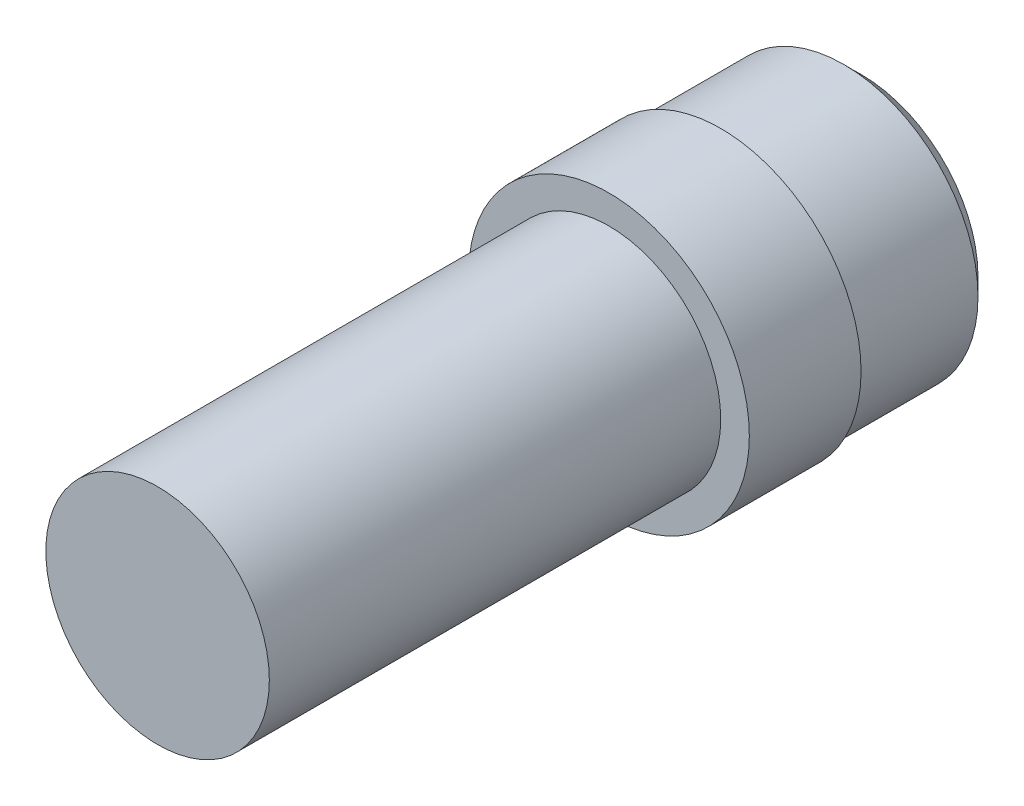
ISO-10303-21;
HEADER;
FILE_DESCRIPTION(('STEP AP214'),'2;1');
FILE_NAME('part.step','',(''),(''),'','','');
FILE_SCHEMA(('AUTOMOTIVE_DESIGN { 1 0 10303 214 1 1 1 1 }'));
ENDSEC;
DATA;
#1=APPLICATION_CONTEXT('core data for automotive mechanical design processes');
#2=APPLICATION_PROTOCOL_DEFINITION('international standard','automotive_design',2000,#1);
#3=PRODUCT_CONTEXT('',#1,'mechanical');
#4=PRODUCT('Part','Part','',(#3));
#5=PRODUCT_RELATED_PRODUCT_CATEGORY('part','',(#4));
#6=PRODUCT_DEFINITION_FORMATION('','',#4);
#7=PRODUCT_DEFINITION_CONTEXT('part definition',#1,'design');
#8=PRODUCT_DEFINITION('design','',#6,#7);
#9=PRODUCT_DEFINITION_SHAPE('','',#8);
#10=(LENGTH_UNIT() NAMED_UNIT(*) SI_UNIT(.MILLI.,.METRE.));
#11=(NAMED_UNIT(*) PLANE_ANGLE_UNIT() SI_UNIT($,.RADIAN.));
#12=(NAMED_UNIT(*) SI_UNIT($,.STERADIAN.) SOLID_ANGLE_UNIT());
#13=UNCERTAINTY_MEASURE_WITH_UNIT(LENGTH_MEASURE(1.E-05),#10,'distance_accuracy_value','');
#14=(GEOMETRIC_REPRESENTATION_CONTEXT(3) GLOBAL_UNCERTAINTY_ASSIGNED_CONTEXT((#13)) GLOBAL_UNIT_ASSIGNED_CONTEXT((#10,
#11,#12)) REPRESENTATION_CONTEXT('',''));
#15=CARTESIAN_POINT('',(0.,0.,0.));
#16=DIRECTION('',(0.,0.,1.));
#17=DIRECTION('',(1.,0.,0.));
#18=AXIS2_PLACEMENT_3D('',#15,#16,#17);
#19=CARTESIAN_POINT('',(0.,0.,20.));
#20=DIRECTION('',(0.,0.,1.));
#21=DIRECTION('',(1.,0.,0.));
#22=AXIS2_PLACEMENT_3D('',#19,#20,#21);
#23=CYLINDRICAL_SURFACE('',#22,3.175);
#24=CARTESIAN_POINT('',(0.,0.,7.175));
#25=DIRECTION('',(0.,0.,1.));
#26=DIRECTION('',(1.,0.,0.));
#27=AXIS2_PLACEMENT_3D('',#24,#25,#26);
#28=CIRCLE('',#27,3.175);
#29=CARTESIAN_POINT('',(3.175,0.,7.175));
#30=VERTEX_POINT('',#29);
#31=EDGE_CURVE('E61',#30,#30,#28,.T.);
#32=ORIENTED_EDGE('',*,*,#31,.T.);
#33=EDGE_LOOP('',(#32));
#34=FACE_BOUND('',#33,.T.);
#35=CARTESIAN_POINT('',(0.,0.,20.));
#36=DIRECTION('',(0.,0.,1.));
#37=DIRECTION('',(1.,0.,0.));
#38=AXIS2_PLACEMENT_3D('',#35,#36,#37);
#39=CIRCLE('',#38,3.175);
#40=CARTESIAN_POINT('',(3.175,0.,20.));
#41=VERTEX_POINT('',#40);
#42=EDGE_CURVE('E46',#41,#41,#39,.T.);
#43=ORIENTED_EDGE('',*,*,#42,.F.);
#44=EDGE_LOOP('',(#43));
#45=FACE_BOUND('',#44,.T.);
#46=ADVANCED_FACE('F34',(#34,#45),#23,.T.);
#47=CARTESIAN_POINT('',(3.175,0.,20.));
#48=DIRECTION('',(0.,0.,1.));
#49=DIRECTION('',(1.,0.,0.));
#50=AXIS2_PLACEMENT_3D('',#47,#48,#49);
#51=PLANE('',#50);
#52=ORIENTED_EDGE('',*,*,#42,.T.);
#53=EDGE_LOOP('',(#52));
#54=FACE_BOUND('',#53,.T.);
#55=ADVANCED_FACE('F81',(#54),#51,.T.);
#56=CARTESIAN_POINT('',(0.,0.,0.));
#57=DIRECTION('',(0.,0.,-1.));
#58=DIRECTION('',(-1.,0.,0.));
#59=AXIS2_PLACEMENT_3D('',#56,#57,#58);
#60=PLANE('',#59);
#61=CARTESIAN_POINT('',(0.,0.,0.));
#62=DIRECTION('',(0.,0.,-1.));
#63=DIRECTION('',(-1.,0.,0.));
#64=AXIS2_PLACEMENT_3D('',#61,#62,#63);
#65=CIRCLE('',#64,3.31);
#66=CARTESIAN_POINT('',(-3.31,0.,0.));
#67=VERTEX_POINT('',#66);
#68=EDGE_CURVE('E10',#67,#67,#65,.T.);
#69=ORIENTED_EDGE('',*,*,#68,.T.);
#70=EDGE_LOOP('',(#69));
#71=FACE_BOUND('',#70,.T.);
#72=ADVANCED_FACE('F85',(#71),#60,.T.);
#73=CARTESIAN_POINT('',(0.,0.,20.));
#74=DIRECTION('',(0.,0.,1.));
#75=DIRECTION('',(1.,0.,0.));
#76=AXIS2_PLACEMENT_3D('',#73,#74,#75);
#77=CYLINDRICAL_SURFACE('',#76,3.81);
#78=CARTESIAN_POINT('',(0.,0.,0.499999999999997));
#79=DIRECTION('',(0.,0.,-1.));
#80=DIRECTION('',(-1.,0.,0.));
#81=AXIS2_PLACEMENT_3D('',#78,#79,#80);
#82=CIRCLE('',#81,3.81);
#83=CARTESIAN_POINT('',(-3.81,0.,0.499999999999997));
#84=VERTEX_POINT('',#83);
#85=EDGE_CURVE('E42',#84,#84,#82,.F.);
#86=ORIENTED_EDGE('',*,*,#85,.T.);
#87=EDGE_LOOP('',(#86));
#88=FACE_BOUND('',#87,.T.);
#89=CARTESIAN_POINT('',(0.,0.,4.));
#90=DIRECTION('',(0.,0.,1.));
#91=DIRECTION('',(1.,0.,0.));
#92=AXIS2_PLACEMENT_3D('',#89,#90,#91);
#93=CIRCLE('',#92,3.81);
#94=CARTESIAN_POINT('',(3.81,0.,4.));
#95=VERTEX_POINT('',#94);
#96=EDGE_CURVE('E50',#95,#95,#93,.T.);
#97=ORIENTED_EDGE('',*,*,#96,.F.);
#98=EDGE_LOOP('',(#97));
#99=FACE_BOUND('',#98,.T.);
#100=ADVANCED_FACE('F91',(#88,#99),#77,.T.);
#101=CARTESIAN_POINT('',(3.81,0.,4.));
#102=DIRECTION('',(0.,0.,-1.));
#103=DIRECTION('',(-1.,0.,0.));
#104=AXIS2_PLACEMENT_3D('',#101,#102,#103);
#105=PLANE('',#104);
#106=ORIENTED_EDGE('',*,*,#96,.T.);
#107=EDGE_LOOP('',(#106));
#108=FACE_BOUND('',#107,.T.);
#109=CARTESIAN_POINT('',(0.,0.,4.));
#110=DIRECTION('',(0.,0.,1.));
#111=DIRECTION('',(1.,0.,0.));
#112=AXIS2_PLACEMENT_3D('',#109,#110,#111);
#113=CIRCLE('',#112,3.9878);
#114=CARTESIAN_POINT('',(3.9878,0.,4.));
#115=VERTEX_POINT('',#114);
#116=EDGE_CURVE('E55',#115,#115,#113,.T.);
#117=ORIENTED_EDGE('',*,*,#116,.F.);
#118=EDGE_LOOP('',(#117));
#119=FACE_BOUND('',#118,.T.);
#120=ADVANCED_FACE('F77',(#108,#119),#105,.T.);
#121=CARTESIAN_POINT('',(0.,0.,20.));
#122=DIRECTION('',(0.,0.,1.));
#123=DIRECTION('',(1.,0.,0.));
#124=AXIS2_PLACEMENT_3D('',#121,#122,#123);
#125=CYLINDRICAL_SURFACE('',#124,3.9878);
#126=ORIENTED_EDGE('',*,*,#116,.T.);
#127=EDGE_LOOP('',(#126));
#128=FACE_BOUND('',#127,.T.);
#129=CARTESIAN_POINT('',(0.,0.,7.175));
#130=DIRECTION('',(0.,0.,1.));
#131=DIRECTION('',(1.,0.,0.));
#132=AXIS2_PLACEMENT_3D('',#129,#130,#131);
#133=CIRCLE('',#132,3.9878);
#134=CARTESIAN_POINT('',(3.9878,0.,7.175));
#135=VERTEX_POINT('',#134);
#136=EDGE_CURVE('E58',#135,#135,#133,.T.);
#137=ORIENTED_EDGE('',*,*,#136,.F.);
#138=EDGE_LOOP('',(#137));
#139=FACE_BOUND('',#138,.T.);
#140=ADVANCED_FACE('F69',(#128,#139),#125,.T.);
#141=CARTESIAN_POINT('',(3.9878,0.,7.175));
#142=DIRECTION('',(0.,0.,1.));
#143=DIRECTION('',(1.,0.,0.));
#144=AXIS2_PLACEMENT_3D('',#141,#142,#143);
#145=PLANE('',#144);
#146=ORIENTED_EDGE('',*,*,#136,.T.);
#147=EDGE_LOOP('',(#146));
#148=FACE_BOUND('',#147,.T.);
#149=ORIENTED_EDGE('',*,*,#31,.F.);
#150=EDGE_LOOP('',(#149));
#151=FACE_BOUND('',#150,.T.);
#152=ADVANCED_FACE('F67',(#148,#151),#145,.T.);
#153=CARTESIAN_POINT('',(0.,0.,0.499999999999997));
#154=DIRECTION('',(0.,0.,1.));
#155=DIRECTION('',(1.,0.,0.));
#156=AXIS2_PLACEMENT_3D('',#153,#154,#155);
#157=CONICAL_SURFACE('',#156,3.81,0.78539816339745);
#158=ORIENTED_EDGE('',*,*,#68,.F.);
#159=EDGE_LOOP('',(#158));
#160=FACE_BOUND('',#159,.T.);
#161=ORIENTED_EDGE('',*,*,#85,.F.);
#162=EDGE_LOOP('',(#161));
#163=FACE_BOUND('',#162,.T.);
#164=ADVANCED_FACE('F37',(#160,#163),#157,.T.);
#165=CLOSED_SHELL('',(#46,#55,#72,#100,#120,#140,#152,#164));
#166=MANIFOLD_SOLID_BREP('B2',#165);
#167=ADVANCED_BREP_SHAPE_REPRESENTATION('',(#18,#166),#14);
#168=SHAPE_DEFINITION_REPRESENTATION(#9,#167);
ENDSEC;
END-ISO-10303-21;
